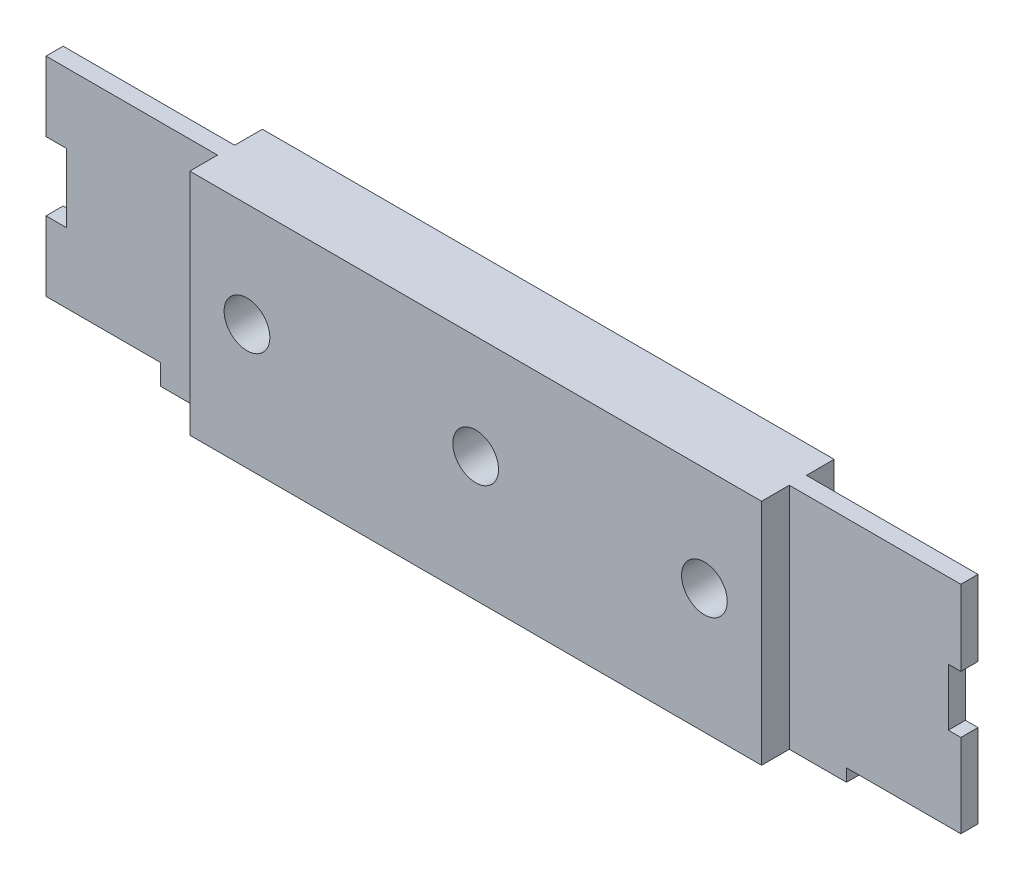
ISO-10303-21;
HEADER;
FILE_DESCRIPTION(('STEP AP214'),'2;1');
FILE_NAME('part.step','',(''),(''),'','','');
FILE_SCHEMA(('AUTOMOTIVE_DESIGN { 1 0 10303 214 1 1 1 1 }'));
ENDSEC;
DATA;
#1=APPLICATION_CONTEXT('core data for automotive mechanical design processes');
#2=APPLICATION_PROTOCOL_DEFINITION('international standard','automotive_design',2000,#1);
#3=PRODUCT_CONTEXT('',#1,'mechanical');
#4=PRODUCT('Part','Part','',(#3));
#5=PRODUCT_RELATED_PRODUCT_CATEGORY('part','',(#4));
#6=PRODUCT_DEFINITION_FORMATION('','',#4);
#7=PRODUCT_DEFINITION_CONTEXT('part definition',#1,'design');
#8=PRODUCT_DEFINITION('design','',#6,#7);
#9=PRODUCT_DEFINITION_SHAPE('','',#8);
#10=(LENGTH_UNIT() NAMED_UNIT(*) SI_UNIT(.MILLI.,.METRE.));
#11=(NAMED_UNIT(*) PLANE_ANGLE_UNIT() SI_UNIT($,.RADIAN.));
#12=(NAMED_UNIT(*) SI_UNIT($,.STERADIAN.) SOLID_ANGLE_UNIT());
#13=UNCERTAINTY_MEASURE_WITH_UNIT(LENGTH_MEASURE(1.E-05),#10,'distance_accuracy_value','');
#14=(GEOMETRIC_REPRESENTATION_CONTEXT(3) GLOBAL_UNCERTAINTY_ASSIGNED_CONTEXT((#13)) GLOBAL_UNIT_ASSIGNED_CONTEXT((#10,
#11,#12)) REPRESENTATION_CONTEXT('',''));
#15=CARTESIAN_POINT('',(0.,0.,0.));
#16=DIRECTION('',(0.,0.,1.));
#17=DIRECTION('',(1.,0.,0.));
#18=AXIS2_PLACEMENT_3D('',#15,#16,#17);
#19=CARTESIAN_POINT('',(0.,0.,0.75));
#20=DIRECTION('',(0.,0.,-1.));
#21=DIRECTION('',(-1.,0.,0.));
#22=AXIS2_PLACEMENT_3D('',#19,#20,#21);
#23=PLANE('',#22);
#24=DIRECTION('',(0.,-1.,0.));
#25=VECTOR('',#24,1.);
#26=CARTESIAN_POINT('',(-25.0000000000001,0.,0.75));
#27=LINE('',#26,#25);
#28=CARTESIAN_POINT('',(-25.0000000000001,9.09999999999999,0.75));
#29=VERTEX_POINT('',#28);
#30=CARTESIAN_POINT('',(-25.0000000000001,-10.9,0.75));
#31=VERTEX_POINT('',#30);
#32=EDGE_CURVE('E218',#29,#31,#27,.T.);
#33=ORIENTED_EDGE('',*,*,#32,.F.);
#34=DIRECTION('',(-1.,0.,0.));
#35=VECTOR('',#34,1.);
#36=CARTESIAN_POINT('',(-40.0000000000001,9.09999999999999,0.75));
#37=LINE('',#36,#35);
#38=CARTESIAN_POINT('',(-40.0000000000001,9.09999999999999,0.75));
#39=VERTEX_POINT('',#38);
#40=EDGE_CURVE('E265',#29,#39,#37,.T.);
#41=ORIENTED_EDGE('',*,*,#40,.T.);
#42=DIRECTION('',(0.,-1.,0.));
#43=VECTOR('',#42,1.);
#44=CARTESIAN_POINT('',(-40.,2.99999999999999,0.75));
#45=LINE('',#44,#43);
#46=CARTESIAN_POINT('',(-40.,2.99999999999999,0.75));
#47=VERTEX_POINT('',#46);
#48=EDGE_CURVE('E233',#39,#47,#45,.T.);
#49=ORIENTED_EDGE('',*,*,#48,.T.);
#50=DIRECTION('',(1.,0.,0.));
#51=VECTOR('',#50,1.);
#52=CARTESIAN_POINT('',(-38.2,2.99999999999999,0.75));
#53=LINE('',#52,#51);
#54=CARTESIAN_POINT('',(-38.2,2.99999999999999,0.75));
#55=VERTEX_POINT('',#54);
#56=EDGE_CURVE('E236',#47,#55,#53,.T.);
#57=ORIENTED_EDGE('',*,*,#56,.T.);
#58=DIRECTION('',(0.,-1.,0.));
#59=VECTOR('',#58,1.);
#60=CARTESIAN_POINT('',(-38.2,-3.00000000000001,0.75));
#61=LINE('',#60,#59);
#62=CARTESIAN_POINT('',(-38.2,-3.00000000000001,0.75));
#63=VERTEX_POINT('',#62);
#64=EDGE_CURVE('E239',#55,#63,#61,.T.);
#65=ORIENTED_EDGE('',*,*,#64,.T.);
#66=DIRECTION('',(-1.,0.,0.));
#67=VECTOR('',#66,1.);
#68=CARTESIAN_POINT('',(-40.,-3.,0.75));
#69=LINE('',#68,#67);
#70=CARTESIAN_POINT('',(-40.,-3.,0.75));
#71=VERTEX_POINT('',#70);
#72=EDGE_CURVE('E241',#63,#71,#69,.T.);
#73=ORIENTED_EDGE('',*,*,#72,.T.);
#74=DIRECTION('',(0.,-1.,0.));
#75=VECTOR('',#74,1.);
#76=CARTESIAN_POINT('',(-40.,-9.1,0.75));
#77=LINE('',#76,#75);
#78=CARTESIAN_POINT('',(-40.,-9.1,0.75));
#79=VERTEX_POINT('',#78);
#80=EDGE_CURVE('E243',#71,#79,#77,.T.);
#81=ORIENTED_EDGE('',*,*,#80,.T.);
#82=DIRECTION('',(1.,0.,0.));
#83=VECTOR('',#82,1.);
#84=CARTESIAN_POINT('',(-30.,-9.1,0.75));
#85=LINE('',#84,#83);
#86=CARTESIAN_POINT('',(-30.,-9.1,0.75));
#87=VERTEX_POINT('',#86);
#88=EDGE_CURVE('E245',#79,#87,#85,.T.);
#89=ORIENTED_EDGE('',*,*,#88,.T.);
#90=DIRECTION('',(0.,-1.,0.));
#91=VECTOR('',#90,1.);
#92=CARTESIAN_POINT('',(-30.,-10.9,0.75));
#93=LINE('',#92,#91);
#94=CARTESIAN_POINT('',(-30.,-10.9,0.75));
#95=VERTEX_POINT('',#94);
#96=EDGE_CURVE('E247',#87,#95,#93,.T.);
#97=ORIENTED_EDGE('',*,*,#96,.T.);
#98=DIRECTION('',(1.,0.,0.));
#99=VECTOR('',#98,1.);
#100=CARTESIAN_POINT('',(30.,-10.9,0.75));
#101=LINE('',#100,#99);
#102=EDGE_CURVE('E56',#95,#31,#101,.T.);
#103=ORIENTED_EDGE('',*,*,#102,.T.);
#104=EDGE_LOOP('',(#33,#41,#49,#57,#65,#73,#81,#89,#97,#103));
#105=FACE_BOUND('',#104,.T.);
#106=ADVANCED_FACE('F33',(#105),#23,.F.);
#107=DIRECTION('',(0.,1.,0.));
#108=VECTOR('',#107,1.);
#109=CARTESIAN_POINT('',(25.,0.,0.75));
#110=LINE('',#109,#108);
#111=CARTESIAN_POINT('',(25.,-10.9,0.75));
#112=VERTEX_POINT('',#111);
#113=CARTESIAN_POINT('',(25.,9.09999999999999,0.75));
#114=VERTEX_POINT('',#113);
#115=EDGE_CURVE('E48',#112,#114,#110,.T.);
#116=ORIENTED_EDGE('',*,*,#115,.F.);
#117=CARTESIAN_POINT('',(30.,-10.9,0.75));
#118=VERTEX_POINT('',#117);
#119=EDGE_CURVE('E249',#112,#118,#101,.T.);
#120=ORIENTED_EDGE('',*,*,#119,.T.);
#121=DIRECTION('',(0.,1.,0.));
#122=VECTOR('',#121,1.);
#123=CARTESIAN_POINT('',(30.,-9.79999999999999,0.75));
#124=LINE('',#123,#122);
#125=CARTESIAN_POINT('',(30.,-9.79999999999999,0.75));
#126=VERTEX_POINT('',#125);
#127=EDGE_CURVE('E251',#118,#126,#124,.T.);
#128=ORIENTED_EDGE('',*,*,#127,.T.);
#129=DIRECTION('',(1.,0.,0.));
#130=VECTOR('',#129,1.);
#131=CARTESIAN_POINT('',(40.,-9.79999999999999,0.75));
#132=LINE('',#131,#130);
#133=CARTESIAN_POINT('',(40.,-9.79999999999999,0.75));
#134=VERTEX_POINT('',#133);
#135=EDGE_CURVE('E253',#126,#134,#132,.T.);
#136=ORIENTED_EDGE('',*,*,#135,.T.);
#137=DIRECTION('',(0.,1.,0.));
#138=VECTOR('',#137,1.);
#139=CARTESIAN_POINT('',(40.,-2.5,0.75));
#140=LINE('',#139,#138);
#141=CARTESIAN_POINT('',(40.,-2.5,0.75));
#142=VERTEX_POINT('',#141);
#143=EDGE_CURVE('E255',#134,#142,#140,.T.);
#144=ORIENTED_EDGE('',*,*,#143,.T.);
#145=DIRECTION('',(-1.,0.,0.));
#146=VECTOR('',#145,1.);
#147=CARTESIAN_POINT('',(38.9,-2.5,0.75));
#148=LINE('',#147,#146);
#149=CARTESIAN_POINT('',(38.9,-2.5,0.75));
#150=VERTEX_POINT('',#149);
#151=EDGE_CURVE('E257',#142,#150,#148,.T.);
#152=ORIENTED_EDGE('',*,*,#151,.T.);
#153=DIRECTION('',(0.,1.,0.));
#154=VECTOR('',#153,1.);
#155=CARTESIAN_POINT('',(38.9,2.5,0.75));
#156=LINE('',#155,#154);
#157=CARTESIAN_POINT('',(38.9,2.5,0.75));
#158=VERTEX_POINT('',#157);
#159=EDGE_CURVE('E259',#150,#158,#156,.T.);
#160=ORIENTED_EDGE('',*,*,#159,.T.);
#161=DIRECTION('',(1.,0.,0.));
#162=VECTOR('',#161,1.);
#163=CARTESIAN_POINT('',(40.,2.5,0.75));
#164=LINE('',#163,#162);
#165=CARTESIAN_POINT('',(40.,2.5,0.75));
#166=VERTEX_POINT('',#165);
#167=EDGE_CURVE('E261',#158,#166,#164,.T.);
#168=ORIENTED_EDGE('',*,*,#167,.T.);
#169=DIRECTION('',(0.,1.,0.));
#170=VECTOR('',#169,1.);
#171=CARTESIAN_POINT('',(40.0000000000001,9.09999999999999,0.75));
#172=LINE('',#171,#170);
#173=CARTESIAN_POINT('',(40.0000000000001,9.09999999999999,0.75));
#174=VERTEX_POINT('',#173);
#175=EDGE_CURVE('E263',#166,#174,#172,.T.);
#176=ORIENTED_EDGE('',*,*,#175,.T.);
#177=EDGE_CURVE('E266',#174,#114,#37,.T.);
#178=ORIENTED_EDGE('',*,*,#177,.T.);
#179=EDGE_LOOP('',(#116,#120,#128,#136,#144,#152,#160,#168,#176,#178));
#180=FACE_BOUND('',#179,.T.);
#181=ADVANCED_FACE('F429',(#180),#23,.F.);
#182=CARTESIAN_POINT('',(0.,0.,-0.75));
#183=DIRECTION('',(0.,0.,-1.));
#184=DIRECTION('',(-1.,0.,0.));
#185=AXIS2_PLACEMENT_3D('',#182,#183,#184);
#186=PLANE('',#185);
#187=DIRECTION('',(-1.,0.,0.));
#188=VECTOR('',#187,1.);
#189=CARTESIAN_POINT('',(-40.0000000000001,9.09999999999999,-0.75));
#190=LINE('',#189,#188);
#191=CARTESIAN_POINT('',(-25.0000000000001,9.09999999999999,-0.75));
#192=VERTEX_POINT('',#191);
#193=CARTESIAN_POINT('',(-40.0000000000001,9.09999999999999,-0.75));
#194=VERTEX_POINT('',#193);
#195=EDGE_CURVE('E301',#192,#194,#190,.T.);
#196=ORIENTED_EDGE('',*,*,#195,.F.);
#197=DIRECTION('',(0.,-1.,0.));
#198=VECTOR('',#197,1.);
#199=CARTESIAN_POINT('',(-25.0000000000001,0.,-0.75));
#200=LINE('',#199,#198);
#201=CARTESIAN_POINT('',(-25.0000000000001,-10.9,-0.75));
#202=VERTEX_POINT('',#201);
#203=EDGE_CURVE('E228',#192,#202,#200,.T.);
#204=ORIENTED_EDGE('',*,*,#203,.T.);
#205=DIRECTION('',(1.,0.,0.));
#206=VECTOR('',#205,1.);
#207=CARTESIAN_POINT('',(30.,-10.9,-0.75));
#208=LINE('',#207,#206);
#209=CARTESIAN_POINT('',(-30.,-10.9,-0.75));
#210=VERTEX_POINT('',#209);
#211=EDGE_CURVE('E284',#210,#202,#208,.T.);
#212=ORIENTED_EDGE('',*,*,#211,.F.);
#213=DIRECTION('',(0.,-1.,0.));
#214=VECTOR('',#213,1.);
#215=CARTESIAN_POINT('',(-30.,-10.9,-0.75));
#216=LINE('',#215,#214);
#217=CARTESIAN_POINT('',(-30.,-9.1,-0.75));
#218=VERTEX_POINT('',#217);
#219=EDGE_CURVE('E281',#218,#210,#216,.T.);
#220=ORIENTED_EDGE('',*,*,#219,.F.);
#221=DIRECTION('',(1.,0.,0.));
#222=VECTOR('',#221,1.);
#223=CARTESIAN_POINT('',(-30.,-9.1,-0.75));
#224=LINE('',#223,#222);
#225=CARTESIAN_POINT('',(-40.,-9.1,-0.75));
#226=VERTEX_POINT('',#225);
#227=EDGE_CURVE('E279',#226,#218,#224,.T.);
#228=ORIENTED_EDGE('',*,*,#227,.F.);
#229=DIRECTION('',(0.,-1.,0.));
#230=VECTOR('',#229,1.);
#231=CARTESIAN_POINT('',(-40.,-9.1,-0.75));
#232=LINE('',#231,#230);
#233=CARTESIAN_POINT('',(-40.,-3.,-0.75));
#234=VERTEX_POINT('',#233);
#235=EDGE_CURVE('E277',#234,#226,#232,.T.);
#236=ORIENTED_EDGE('',*,*,#235,.F.);
#237=DIRECTION('',(-1.,0.,0.));
#238=VECTOR('',#237,1.);
#239=CARTESIAN_POINT('',(-40.,-3.,-0.75));
#240=LINE('',#239,#238);
#241=CARTESIAN_POINT('',(-38.2,-3.00000000000001,-0.75));
#242=VERTEX_POINT('',#241);
#243=EDGE_CURVE('E275',#242,#234,#240,.T.);
#244=ORIENTED_EDGE('',*,*,#243,.F.);
#245=DIRECTION('',(0.,-1.,0.));
#246=VECTOR('',#245,1.);
#247=CARTESIAN_POINT('',(-38.2,-3.00000000000001,-0.75));
#248=LINE('',#247,#246);
#249=CARTESIAN_POINT('',(-38.2,2.99999999999999,-0.75));
#250=VERTEX_POINT('',#249);
#251=EDGE_CURVE('E273',#250,#242,#248,.T.);
#252=ORIENTED_EDGE('',*,*,#251,.F.);
#253=DIRECTION('',(1.,0.,0.));
#254=VECTOR('',#253,1.);
#255=CARTESIAN_POINT('',(-38.2,2.99999999999999,-0.75));
#256=LINE('',#255,#254);
#257=CARTESIAN_POINT('',(-40.,2.99999999999999,-0.75));
#258=VERTEX_POINT('',#257);
#259=EDGE_CURVE('E271',#258,#250,#256,.T.);
#260=ORIENTED_EDGE('',*,*,#259,.F.);
#261=DIRECTION('',(0.,-1.,0.));
#262=VECTOR('',#261,1.);
#263=CARTESIAN_POINT('',(-40.,2.99999999999999,-0.75));
#264=LINE('',#263,#262);
#265=EDGE_CURVE('E232',#194,#258,#264,.T.);
#266=ORIENTED_EDGE('',*,*,#265,.F.);
#267=EDGE_LOOP('',(#196,#204,#212,#220,#228,#236,#244,#252,#260,#266));
#268=FACE_BOUND('',#267,.T.);
#269=ADVANCED_FACE('F355',(#268),#186,.T.);
#270=CARTESIAN_POINT('',(25.,-10.9,-0.75));
#271=VERTEX_POINT('',#270);
#272=CARTESIAN_POINT('',(30.,-10.9,-0.75));
#273=VERTEX_POINT('',#272);
#274=EDGE_CURVE('E283',#271,#273,#208,.T.);
#275=ORIENTED_EDGE('',*,*,#274,.F.);
#276=DIRECTION('',(0.,1.,0.));
#277=VECTOR('',#276,1.);
#278=CARTESIAN_POINT('',(25.,0.,-0.75));
#279=LINE('',#278,#277);
#280=CARTESIAN_POINT('',(25.,9.09999999999999,-0.75));
#281=VERTEX_POINT('',#280);
#282=EDGE_CURVE('E219',#271,#281,#279,.T.);
#283=ORIENTED_EDGE('',*,*,#282,.T.);
#284=CARTESIAN_POINT('',(40.0000000000001,9.09999999999999,-0.75));
#285=VERTEX_POINT('',#284);
#286=EDGE_CURVE('E237',#285,#281,#190,.T.);
#287=ORIENTED_EDGE('',*,*,#286,.F.);
#288=DIRECTION('',(0.,1.,0.));
#289=VECTOR('',#288,1.);
#290=CARTESIAN_POINT('',(40.0000000000001,9.09999999999999,-0.75));
#291=LINE('',#290,#289);
#292=CARTESIAN_POINT('',(40.,2.5,-0.75));
#293=VERTEX_POINT('',#292);
#294=EDGE_CURVE('E299',#293,#285,#291,.T.);
#295=ORIENTED_EDGE('',*,*,#294,.F.);
#296=DIRECTION('',(1.,0.,0.));
#297=VECTOR('',#296,1.);
#298=CARTESIAN_POINT('',(40.,2.5,-0.75));
#299=LINE('',#298,#297);
#300=CARTESIAN_POINT('',(38.9,2.5,-0.75));
#301=VERTEX_POINT('',#300);
#302=EDGE_CURVE('E297',#301,#293,#299,.T.);
#303=ORIENTED_EDGE('',*,*,#302,.F.);
#304=DIRECTION('',(0.,1.,0.));
#305=VECTOR('',#304,1.);
#306=CARTESIAN_POINT('',(38.9,2.5,-0.75));
#307=LINE('',#306,#305);
#308=CARTESIAN_POINT('',(38.9,-2.5,-0.75));
#309=VERTEX_POINT('',#308);
#310=EDGE_CURVE('E295',#309,#301,#307,.T.);
#311=ORIENTED_EDGE('',*,*,#310,.F.);
#312=DIRECTION('',(-1.,0.,0.));
#313=VECTOR('',#312,1.);
#314=CARTESIAN_POINT('',(38.9,-2.5,-0.75));
#315=LINE('',#314,#313);
#316=CARTESIAN_POINT('',(40.,-2.5,-0.75));
#317=VERTEX_POINT('',#316);
#318=EDGE_CURVE('E293',#317,#309,#315,.T.);
#319=ORIENTED_EDGE('',*,*,#318,.F.);
#320=DIRECTION('',(0.,1.,0.));
#321=VECTOR('',#320,1.);
#322=CARTESIAN_POINT('',(40.,-2.5,-0.75));
#323=LINE('',#322,#321);
#324=CARTESIAN_POINT('',(40.,-9.79999999999999,-0.75));
#325=VERTEX_POINT('',#324);
#326=EDGE_CURVE('E291',#325,#317,#323,.T.);
#327=ORIENTED_EDGE('',*,*,#326,.F.);
#328=DIRECTION('',(1.,0.,0.));
#329=VECTOR('',#328,1.);
#330=CARTESIAN_POINT('',(40.,-9.79999999999999,-0.75));
#331=LINE('',#330,#329);
#332=CARTESIAN_POINT('',(30.,-9.79999999999999,-0.75));
#333=VERTEX_POINT('',#332);
#334=EDGE_CURVE('E289',#333,#325,#331,.T.);
#335=ORIENTED_EDGE('',*,*,#334,.F.);
#336=DIRECTION('',(0.,1.,0.));
#337=VECTOR('',#336,1.);
#338=CARTESIAN_POINT('',(30.,-9.79999999999999,-0.75));
#339=LINE('',#338,#337);
#340=EDGE_CURVE('E287',#273,#333,#339,.T.);
#341=ORIENTED_EDGE('',*,*,#340,.F.);
#342=EDGE_LOOP('',(#275,#283,#287,#295,#303,#311,#319,#327,#335,#341));
#343=FACE_BOUND('',#342,.T.);
#344=ADVANCED_FACE('F417',(#343),#186,.T.);
#345=CARTESIAN_POINT('',(-40.,2.99999999999999,0.75));
#346=DIRECTION('',(1.,0.,0.));
#347=DIRECTION('',(0.,1.,0.));
#348=AXIS2_PLACEMENT_3D('',#345,#346,#347);
#349=PLANE('',#348);
#350=ORIENTED_EDGE('',*,*,#265,.T.);
#351=DIRECTION('',(0.,0.,-1.));
#352=VECTOR('',#351,1.);
#353=CARTESIAN_POINT('',(-40.,2.99999999999999,0.75));
#354=LINE('',#353,#352);
#355=EDGE_CURVE('E11',#47,#258,#354,.T.);
#356=ORIENTED_EDGE('',*,*,#355,.F.);
#357=ORIENTED_EDGE('',*,*,#48,.F.);
#358=DIRECTION('',(0.,0.,-1.));
#359=VECTOR('',#358,1.);
#360=CARTESIAN_POINT('',(-40.0000000000001,9.09999999999999,0.75));
#361=LINE('',#360,#359);
#362=EDGE_CURVE('E268',#39,#194,#361,.T.);
#363=ORIENTED_EDGE('',*,*,#362,.T.);
#364=EDGE_LOOP('',(#350,#356,#357,#363));
#365=FACE_BOUND('',#364,.T.);
#366=ADVANCED_FACE('F35',(#365),#349,.F.);
#367=CARTESIAN_POINT('',(-38.2,2.99999999999999,0.75));
#368=DIRECTION('',(0.,1.,0.));
#369=DIRECTION('',(-1.,0.,0.));
#370=AXIS2_PLACEMENT_3D('',#367,#368,#369);
#371=PLANE('',#370);
#372=ORIENTED_EDGE('',*,*,#259,.T.);
#373=DIRECTION('',(0.,0.,-1.));
#374=VECTOR('',#373,1.);
#375=CARTESIAN_POINT('',(-38.2,2.99999999999999,0.75));
#376=LINE('',#375,#374);
#377=EDGE_CURVE('E41',#55,#250,#376,.T.);
#378=ORIENTED_EDGE('',*,*,#377,.F.);
#379=ORIENTED_EDGE('',*,*,#56,.F.);
#380=ORIENTED_EDGE('',*,*,#355,.T.);
#381=EDGE_LOOP('',(#372,#378,#379,#380));
#382=FACE_BOUND('',#381,.T.);
#383=ADVANCED_FACE('F371',(#382),#371,.F.);
#384=CARTESIAN_POINT('',(-38.2,-3.00000000000001,0.75));
#385=DIRECTION('',(1.,0.,0.));
#386=DIRECTION('',(0.,0.,-1.));
#387=AXIS2_PLACEMENT_3D('',#384,#385,#386);
#388=PLANE('',#387);
#389=ORIENTED_EDGE('',*,*,#251,.T.);
#390=DIRECTION('',(0.,0.,-1.));
#391=VECTOR('',#390,1.);
#392=CARTESIAN_POINT('',(-38.2,-3.00000000000001,0.75));
#393=LINE('',#392,#391);
#394=EDGE_CURVE('E342',#63,#242,#393,.T.);
#395=ORIENTED_EDGE('',*,*,#394,.F.);
#396=ORIENTED_EDGE('',*,*,#64,.F.);
#397=ORIENTED_EDGE('',*,*,#377,.T.);
#398=EDGE_LOOP('',(#389,#395,#396,#397));
#399=FACE_BOUND('',#398,.T.);
#400=ADVANCED_FACE('F349',(#399),#388,.F.);
#401=CARTESIAN_POINT('',(-40.,-3.,0.75));
#402=DIRECTION('',(0.,-1.,0.));
#403=DIRECTION('',(1.,0.,0.));
#404=AXIS2_PLACEMENT_3D('',#401,#402,#403);
#405=PLANE('',#404);
#406=ORIENTED_EDGE('',*,*,#243,.T.);
#407=DIRECTION('',(0.,0.,-1.));
#408=VECTOR('',#407,1.);
#409=CARTESIAN_POINT('',(-40.,-3.,0.75));
#410=LINE('',#409,#408);
#411=EDGE_CURVE('E339',#71,#234,#410,.T.);
#412=ORIENTED_EDGE('',*,*,#411,.F.);
#413=ORIENTED_EDGE('',*,*,#72,.F.);
#414=ORIENTED_EDGE('',*,*,#394,.T.);
#415=EDGE_LOOP('',(#406,#412,#413,#414));
#416=FACE_BOUND('',#415,.T.);
#417=ADVANCED_FACE('F361',(#416),#405,.F.);
#418=CARTESIAN_POINT('',(-40.,-9.1,0.75));
#419=DIRECTION('',(1.,0.,0.));
#420=DIRECTION('',(0.,1.,0.));
#421=AXIS2_PLACEMENT_3D('',#418,#419,#420);
#422=PLANE('',#421);
#423=ORIENTED_EDGE('',*,*,#235,.T.);
#424=DIRECTION('',(0.,0.,-1.));
#425=VECTOR('',#424,1.);
#426=CARTESIAN_POINT('',(-40.,-9.1,0.75));
#427=LINE('',#426,#425);
#428=EDGE_CURVE('E336',#79,#226,#427,.T.);
#429=ORIENTED_EDGE('',*,*,#428,.F.);
#430=ORIENTED_EDGE('',*,*,#80,.F.);
#431=ORIENTED_EDGE('',*,*,#411,.T.);
#432=EDGE_LOOP('',(#423,#429,#430,#431));
#433=FACE_BOUND('',#432,.T.);
#434=ADVANCED_FACE('F365',(#433),#422,.F.);
#435=CARTESIAN_POINT('',(-30.,-9.1,0.75));
#436=DIRECTION('',(0.,1.,0.));
#437=DIRECTION('',(-1.,0.,0.));
#438=AXIS2_PLACEMENT_3D('',#435,#436,#437);
#439=PLANE('',#438);
#440=ORIENTED_EDGE('',*,*,#227,.T.);
#441=DIRECTION('',(0.,0.,-1.));
#442=VECTOR('',#441,1.);
#443=CARTESIAN_POINT('',(-30.,-9.1,0.75));
#444=LINE('',#443,#442);
#445=EDGE_CURVE('E333',#87,#218,#444,.T.);
#446=ORIENTED_EDGE('',*,*,#445,.F.);
#447=ORIENTED_EDGE('',*,*,#88,.F.);
#448=ORIENTED_EDGE('',*,*,#428,.T.);
#449=EDGE_LOOP('',(#440,#446,#447,#448));
#450=FACE_BOUND('',#449,.T.);
#451=ADVANCED_FACE('F505',(#450),#439,.F.);
#452=CARTESIAN_POINT('',(-30.,-10.9,0.75));
#453=DIRECTION('',(1.,0.,0.));
#454=DIRECTION('',(0.,1.,0.));
#455=AXIS2_PLACEMENT_3D('',#452,#453,#454);
#456=PLANE('',#455);
#457=ORIENTED_EDGE('',*,*,#219,.T.);
#458=DIRECTION('',(0.,0.,-1.));
#459=VECTOR('',#458,1.);
#460=CARTESIAN_POINT('',(-30.,-10.9,0.75));
#461=LINE('',#460,#459);
#462=EDGE_CURVE('E330',#95,#210,#461,.T.);
#463=ORIENTED_EDGE('',*,*,#462,.F.);
#464=ORIENTED_EDGE('',*,*,#96,.F.);
#465=ORIENTED_EDGE('',*,*,#445,.T.);
#466=EDGE_LOOP('',(#457,#463,#464,#465));
#467=FACE_BOUND('',#466,.T.);
#468=ADVANCED_FACE('F502',(#467),#456,.F.);
#469=CARTESIAN_POINT('',(30.,-10.9,0.75));
#470=DIRECTION('',(0.,1.,0.));
#471=DIRECTION('',(-1.,0.,0.));
#472=AXIS2_PLACEMENT_3D('',#469,#470,#471);
#473=PLANE('',#472);
#474=ORIENTED_EDGE('',*,*,#119,.F.);
#475=DIRECTION('',(0.,0.,-1.));
#476=VECTOR('',#475,1.);
#477=CARTESIAN_POINT('',(25.,-10.9,3.175));
#478=LINE('',#477,#476);
#479=CARTESIAN_POINT('',(25.,-10.9,3.175));
#480=VERTEX_POINT('',#479);
#481=EDGE_CURVE('E201',#480,#112,#478,.T.);
#482=ORIENTED_EDGE('',*,*,#481,.F.);
#483=DIRECTION('',(1.,0.,0.));
#484=VECTOR('',#483,1.);
#485=CARTESIAN_POINT('',(-25.0000000000001,-10.9,3.175));
#486=LINE('',#485,#484);
#487=CARTESIAN_POINT('',(-25.0000000000001,-10.9,3.175));
#488=VERTEX_POINT('',#487);
#489=EDGE_CURVE('E195',#488,#480,#486,.T.);
#490=ORIENTED_EDGE('',*,*,#489,.F.);
#491=DIRECTION('',(0.,0.,-1.));
#492=VECTOR('',#491,1.);
#493=CARTESIAN_POINT('',(-25.0000000000001,-10.9,3.175));
#494=LINE('',#493,#492);
#495=EDGE_CURVE('E199',#488,#31,#494,.T.);
#496=ORIENTED_EDGE('',*,*,#495,.T.);
#497=ORIENTED_EDGE('',*,*,#102,.F.);
#498=ORIENTED_EDGE('',*,*,#462,.T.);
#499=ORIENTED_EDGE('',*,*,#211,.T.);
#500=CARTESIAN_POINT('',(-25.0000000000001,-10.9,-3.175));
#501=VERTEX_POINT('',#500);
#502=EDGE_CURVE('E220',#202,#501,#494,.T.);
#503=ORIENTED_EDGE('',*,*,#502,.T.);
#504=DIRECTION('',(1.,0.,0.));
#505=VECTOR('',#504,1.);
#506=CARTESIAN_POINT('',(-25.0000000000001,-10.9,-3.175));
#507=LINE('',#506,#505);
#508=CARTESIAN_POINT('',(25.,-10.9,-3.175));
#509=VERTEX_POINT('',#508);
#510=EDGE_CURVE('E391',#501,#509,#507,.T.);
#511=ORIENTED_EDGE('',*,*,#510,.T.);
#512=EDGE_CURVE('E407',#271,#509,#478,.T.);
#513=ORIENTED_EDGE('',*,*,#512,.F.);
#514=ORIENTED_EDGE('',*,*,#274,.T.);
#515=DIRECTION('',(0.,0.,-1.));
#516=VECTOR('',#515,1.);
#517=CARTESIAN_POINT('',(30.,-10.9,0.75));
#518=LINE('',#517,#516);
#519=EDGE_CURVE('E327',#118,#273,#518,.T.);
#520=ORIENTED_EDGE('',*,*,#519,.F.);
#521=EDGE_LOOP('',(#474,#482,#490,#496,#497,#498,#499,#503,#511,#513,#514,#520));
#522=FACE_BOUND('',#521,.T.);
#523=ADVANCED_FACE('F197',(#522),#473,.F.);
#524=CARTESIAN_POINT('',(30.,-9.79999999999999,0.75));
#525=DIRECTION('',(-1.,0.,0.));
#526=DIRECTION('',(0.,0.,1.));
#527=AXIS2_PLACEMENT_3D('',#524,#525,#526);
#528=PLANE('',#527);
#529=ORIENTED_EDGE('',*,*,#340,.T.);
#530=DIRECTION('',(0.,0.,-1.));
#531=VECTOR('',#530,1.);
#532=CARTESIAN_POINT('',(30.,-9.79999999999999,0.75));
#533=LINE('',#532,#531);
#534=EDGE_CURVE('E324',#126,#333,#533,.T.);
#535=ORIENTED_EDGE('',*,*,#534,.F.);
#536=ORIENTED_EDGE('',*,*,#127,.F.);
#537=ORIENTED_EDGE('',*,*,#519,.T.);
#538=EDGE_LOOP('',(#529,#535,#536,#537));
#539=FACE_BOUND('',#538,.T.);
#540=ADVANCED_FACE('F422',(#539),#528,.F.);
#541=CARTESIAN_POINT('',(40.,-9.79999999999999,0.75));
#542=DIRECTION('',(0.,1.,0.));
#543=DIRECTION('',(-1.,0.,0.));
#544=AXIS2_PLACEMENT_3D('',#541,#542,#543);
#545=PLANE('',#544);
#546=ORIENTED_EDGE('',*,*,#334,.T.);
#547=DIRECTION('',(0.,0.,-1.));
#548=VECTOR('',#547,1.);
#549=CARTESIAN_POINT('',(40.,-9.79999999999999,0.75));
#550=LINE('',#549,#548);
#551=EDGE_CURVE('E321',#134,#325,#550,.T.);
#552=ORIENTED_EDGE('',*,*,#551,.F.);
#553=ORIENTED_EDGE('',*,*,#135,.F.);
#554=ORIENTED_EDGE('',*,*,#534,.T.);
#555=EDGE_LOOP('',(#546,#552,#553,#554));
#556=FACE_BOUND('',#555,.T.);
#557=ADVANCED_FACE('F426',(#556),#545,.F.);
#558=CARTESIAN_POINT('',(40.,-2.5,0.75));
#559=DIRECTION('',(-1.,0.,0.));
#560=DIRECTION('',(0.,-1.,0.));
#561=AXIS2_PLACEMENT_3D('',#558,#559,#560);
#562=PLANE('',#561);
#563=ORIENTED_EDGE('',*,*,#326,.T.);
#564=DIRECTION('',(0.,0.,-1.));
#565=VECTOR('',#564,1.);
#566=CARTESIAN_POINT('',(40.,-2.5,0.75));
#567=LINE('',#566,#565);
#568=EDGE_CURVE('E318',#142,#317,#567,.T.);
#569=ORIENTED_EDGE('',*,*,#568,.F.);
#570=ORIENTED_EDGE('',*,*,#143,.F.);
#571=ORIENTED_EDGE('',*,*,#551,.T.);
#572=EDGE_LOOP('',(#563,#569,#570,#571));
#573=FACE_BOUND('',#572,.T.);
#574=ADVANCED_FACE('F491',(#573),#562,.F.);
#575=CARTESIAN_POINT('',(38.9,-2.5,0.75));
#576=DIRECTION('',(0.,-1.,0.));
#577=DIRECTION('',(0.,0.,-1.));
#578=AXIS2_PLACEMENT_3D('',#575,#576,#577);
#579=PLANE('',#578);
#580=ORIENTED_EDGE('',*,*,#318,.T.);
#581=DIRECTION('',(0.,0.,-1.));
#582=VECTOR('',#581,1.);
#583=CARTESIAN_POINT('',(38.9,-2.5,0.75));
#584=LINE('',#583,#582);
#585=EDGE_CURVE('E315',#150,#309,#584,.T.);
#586=ORIENTED_EDGE('',*,*,#585,.F.);
#587=ORIENTED_EDGE('',*,*,#151,.F.);
#588=ORIENTED_EDGE('',*,*,#568,.T.);
#589=EDGE_LOOP('',(#580,#586,#587,#588));
#590=FACE_BOUND('',#589,.T.);
#591=ADVANCED_FACE('F487',(#590),#579,.F.);
#592=CARTESIAN_POINT('',(38.9,2.5,0.75));
#593=DIRECTION('',(-1.,0.,0.));
#594=DIRECTION('',(0.,0.,1.));
#595=AXIS2_PLACEMENT_3D('',#592,#593,#594);
#596=PLANE('',#595);
#597=ORIENTED_EDGE('',*,*,#310,.T.);
#598=DIRECTION('',(0.,0.,-1.));
#599=VECTOR('',#598,1.);
#600=CARTESIAN_POINT('',(38.9,2.5,0.75));
#601=LINE('',#600,#599);
#602=EDGE_CURVE('E312',#158,#301,#601,.T.);
#603=ORIENTED_EDGE('',*,*,#602,.F.);
#604=ORIENTED_EDGE('',*,*,#159,.F.);
#605=ORIENTED_EDGE('',*,*,#585,.T.);
#606=EDGE_LOOP('',(#597,#603,#604,#605));
#607=FACE_BOUND('',#606,.T.);
#608=ADVANCED_FACE('F483',(#607),#596,.F.);
#609=CARTESIAN_POINT('',(40.,2.5,0.75));
#610=DIRECTION('',(0.,1.,0.));
#611=DIRECTION('',(0.,0.,1.));
#612=AXIS2_PLACEMENT_3D('',#609,#610,#611);
#613=PLANE('',#612);
#614=ORIENTED_EDGE('',*,*,#302,.T.);
#615=DIRECTION('',(0.,0.,-1.));
#616=VECTOR('',#615,1.);
#617=CARTESIAN_POINT('',(40.,2.5,0.75));
#618=LINE('',#617,#616);
#619=EDGE_CURVE('E309',#166,#293,#618,.T.);
#620=ORIENTED_EDGE('',*,*,#619,.F.);
#621=ORIENTED_EDGE('',*,*,#167,.F.);
#622=ORIENTED_EDGE('',*,*,#602,.T.);
#623=EDGE_LOOP('',(#614,#620,#621,#622));
#624=FACE_BOUND('',#623,.T.);
#625=ADVANCED_FACE('F479',(#624),#613,.F.);
#626=CARTESIAN_POINT('',(40.0000000000001,9.09999999999999,0.75));
#627=DIRECTION('',(-1.,0.,0.));
#628=DIRECTION('',(0.,-1.,0.));
#629=AXIS2_PLACEMENT_3D('',#626,#627,#628);
#630=PLANE('',#629);
#631=ORIENTED_EDGE('',*,*,#294,.T.);
#632=DIRECTION('',(0.,0.,-1.));
#633=VECTOR('',#632,1.);
#634=CARTESIAN_POINT('',(40.0000000000001,9.09999999999999,0.75));
#635=LINE('',#634,#633);
#636=EDGE_CURVE('E306',#174,#285,#635,.T.);
#637=ORIENTED_EDGE('',*,*,#636,.F.);
#638=ORIENTED_EDGE('',*,*,#175,.F.);
#639=ORIENTED_EDGE('',*,*,#619,.T.);
#640=EDGE_LOOP('',(#631,#637,#638,#639));
#641=FACE_BOUND('',#640,.T.);
#642=ADVANCED_FACE('F476',(#641),#630,.F.);
#643=CARTESIAN_POINT('',(-40.0000000000001,9.09999999999999,0.75));
#644=DIRECTION('',(0.,-1.,0.));
#645=DIRECTION('',(0.,0.,-1.));
#646=AXIS2_PLACEMENT_3D('',#643,#644,#645);
#647=PLANE('',#646);
#648=ORIENTED_EDGE('',*,*,#286,.T.);
#649=DIRECTION('',(0.,0.,-1.));
#650=VECTOR('',#649,1.);
#651=CARTESIAN_POINT('',(25.,9.09999999999999,3.175));
#652=LINE('',#651,#650);
#653=CARTESIAN_POINT('',(25.,9.09999999999999,-3.175));
#654=VERTEX_POINT('',#653);
#655=EDGE_CURVE('E404',#281,#654,#652,.T.);
#656=ORIENTED_EDGE('',*,*,#655,.T.);
#657=DIRECTION('',(-1.,0.,0.));
#658=VECTOR('',#657,1.);
#659=CARTESIAN_POINT('',(-25.0000000000001,9.09999999999999,-3.175));
#660=LINE('',#659,#658);
#661=CARTESIAN_POINT('',(-25.0000000000001,9.09999999999999,-3.175));
#662=VERTEX_POINT('',#661);
#663=EDGE_CURVE('E215',#654,#662,#660,.T.);
#664=ORIENTED_EDGE('',*,*,#663,.T.);
#665=DIRECTION('',(0.,0.,-1.));
#666=VECTOR('',#665,1.);
#667=CARTESIAN_POINT('',(-25.0000000000001,9.09999999999999,3.175));
#668=LINE('',#667,#666);
#669=EDGE_CURVE('E379',#192,#662,#668,.T.);
#670=ORIENTED_EDGE('',*,*,#669,.F.);
#671=ORIENTED_EDGE('',*,*,#195,.T.);
#672=ORIENTED_EDGE('',*,*,#362,.F.);
#673=ORIENTED_EDGE('',*,*,#40,.F.);
#674=CARTESIAN_POINT('',(-25.0000000000001,9.09999999999999,3.175));
#675=VERTEX_POINT('',#674);
#676=EDGE_CURVE('E384',#675,#29,#668,.T.);
#677=ORIENTED_EDGE('',*,*,#676,.F.);
#678=DIRECTION('',(-1.,0.,0.));
#679=VECTOR('',#678,1.);
#680=CARTESIAN_POINT('',(-25.0000000000001,9.09999999999999,3.175));
#681=LINE('',#680,#679);
#682=CARTESIAN_POINT('',(25.,9.09999999999999,3.175));
#683=VERTEX_POINT('',#682);
#684=EDGE_CURVE('E211',#683,#675,#681,.T.);
#685=ORIENTED_EDGE('',*,*,#684,.F.);
#686=EDGE_CURVE('E405',#683,#114,#652,.T.);
#687=ORIENTED_EDGE('',*,*,#686,.T.);
#688=ORIENTED_EDGE('',*,*,#177,.F.);
#689=ORIENTED_EDGE('',*,*,#636,.T.);
#690=EDGE_LOOP('',(#648,#656,#664,#670,#671,#672,#673,#677,#685,#687,#688,#689));
#691=FACE_BOUND('',#690,.T.);
#692=ADVANCED_FACE('F377',(#691),#647,.F.);
#693=CARTESIAN_POINT('',(25.,9.09999999999999,3.175));
#694=DIRECTION('',(-1.,0.,0.));
#695=DIRECTION('',(0.,-1.,0.));
#696=AXIS2_PLACEMENT_3D('',#693,#694,#695);
#697=PLANE('',#696);
#698=ORIENTED_EDGE('',*,*,#282,.F.);
#699=ORIENTED_EDGE('',*,*,#512,.T.);
#700=DIRECTION('',(0.,1.,0.));
#701=VECTOR('',#700,1.);
#702=CARTESIAN_POINT('',(25.,9.09999999999999,-3.175));
#703=LINE('',#702,#701);
#704=EDGE_CURVE('E397',#509,#654,#703,.T.);
#705=ORIENTED_EDGE('',*,*,#704,.T.);
#706=ORIENTED_EDGE('',*,*,#655,.F.);
#707=EDGE_LOOP('',(#698,#699,#705,#706));
#708=FACE_BOUND('',#707,.T.);
#709=ADVANCED_FACE('F412',(#708),#697,.F.);
#710=CARTESIAN_POINT('',(-25.0000000000001,9.09999999999999,3.175));
#711=DIRECTION('',(1.,0.,0.));
#712=DIRECTION('',(0.,1.,0.));
#713=AXIS2_PLACEMENT_3D('',#710,#711,#712);
#714=PLANE('',#713);
#715=ORIENTED_EDGE('',*,*,#203,.F.);
#716=ORIENTED_EDGE('',*,*,#669,.T.);
#717=DIRECTION('',(0.,-1.,0.));
#718=VECTOR('',#717,1.);
#719=CARTESIAN_POINT('',(-25.0000000000001,9.09999999999999,-3.175));
#720=LINE('',#719,#718);
#721=EDGE_CURVE('E387',#662,#501,#720,.T.);
#722=ORIENTED_EDGE('',*,*,#721,.T.);
#723=ORIENTED_EDGE('',*,*,#502,.F.);
#724=EDGE_LOOP('',(#715,#716,#722,#723));
#725=FACE_BOUND('',#724,.T.);
#726=ADVANCED_FACE('F386',(#725),#714,.F.);
#727=CARTESIAN_POINT('',(0.,0.,-3.175));
#728=DIRECTION('',(0.,0.,1.));
#729=DIRECTION('',(1.,0.,0.));
#730=AXIS2_PLACEMENT_3D('',#727,#728,#729);
#731=PLANE('',#730);
#732=ORIENTED_EDGE('',*,*,#721,.F.);
#733=ORIENTED_EDGE('',*,*,#663,.F.);
#734=ORIENTED_EDGE('',*,*,#704,.F.);
#735=ORIENTED_EDGE('',*,*,#510,.F.);
#736=EDGE_LOOP('',(#732,#733,#734,#735));
#737=FACE_BOUND('',#736,.T.);
#738=CARTESIAN_POINT('',(-20.,0.,-3.175));
#739=DIRECTION('',(0.,0.,1.));
#740=DIRECTION('',(1.,0.,0.));
#741=AXIS2_PLACEMENT_3D('',#738,#739,#740);
#742=CIRCLE('',#741,2.00000000000003);
#743=CARTESIAN_POINT('',(-18.,0.,-3.175));
#744=VERTEX_POINT('',#743);
#745=EDGE_CURVE('E435',#744,#744,#742,.T.);
#746=ORIENTED_EDGE('',*,*,#745,.T.);
#747=EDGE_LOOP('',(#746));
#748=FACE_BOUND('',#747,.T.);
#749=CARTESIAN_POINT('',(0.,0.,-3.175));
#750=DIRECTION('',(0.,0.,1.));
#751=DIRECTION('',(1.,0.,0.));
#752=AXIS2_PLACEMENT_3D('',#749,#750,#751);
#753=CIRCLE('',#752,2.00000000000002);
#754=CARTESIAN_POINT('',(2.00000000000002,0.,-3.175));
#755=VERTEX_POINT('',#754);
#756=EDGE_CURVE('E441',#755,#755,#753,.T.);
#757=ORIENTED_EDGE('',*,*,#756,.T.);
#758=EDGE_LOOP('',(#757));
#759=FACE_BOUND('',#758,.T.);
#760=CARTESIAN_POINT('',(20.,0.,-3.175));
#761=DIRECTION('',(0.,0.,1.));
#762=DIRECTION('',(1.,0.,0.));
#763=AXIS2_PLACEMENT_3D('',#760,#761,#762);
#764=CIRCLE('',#763,2.00000000000003);
#765=CARTESIAN_POINT('',(22.,0.,-3.175));
#766=VERTEX_POINT('',#765);
#767=EDGE_CURVE('E447',#766,#766,#764,.T.);
#768=ORIENTED_EDGE('',*,*,#767,.T.);
#769=EDGE_LOOP('',(#768));
#770=FACE_BOUND('',#769,.T.);
#771=ADVANCED_FACE('F394',(#737,#748,#759,#770),#731,.F.);
#772=CARTESIAN_POINT('',(20.,0.,0.75));
#773=DIRECTION('',(0.,0.,-1.));
#774=DIRECTION('',(-1.,0.,0.));
#775=AXIS2_PLACEMENT_3D('',#772,#773,#774);
#776=CYLINDRICAL_SURFACE('',#775,2.00000000000003);
#777=ORIENTED_EDGE('',*,*,#767,.F.);
#778=EDGE_LOOP('',(#777));
#779=FACE_BOUND('',#778,.T.);
#780=CARTESIAN_POINT('',(20.,0.,3.175));
#781=DIRECTION('',(0.,0.,1.));
#782=DIRECTION('',(1.,0.,0.));
#783=AXIS2_PLACEMENT_3D('',#780,#781,#782);
#784=CIRCLE('',#783,2.00000000000003);
#785=CARTESIAN_POINT('',(22.,0.,3.175));
#786=VERTEX_POINT('',#785);
#787=EDGE_CURVE('E444',#786,#786,#784,.T.);
#788=ORIENTED_EDGE('',*,*,#787,.T.);
#789=EDGE_LOOP('',(#788));
#790=FACE_BOUND('',#789,.T.);
#791=ADVANCED_FACE('F453',(#779,#790),#776,.F.);
#792=CARTESIAN_POINT('',(0.,0.,0.75));
#793=DIRECTION('',(0.,0.,-1.));
#794=DIRECTION('',(-1.,0.,0.));
#795=AXIS2_PLACEMENT_3D('',#792,#793,#794);
#796=CYLINDRICAL_SURFACE('',#795,2.00000000000002);
#797=ORIENTED_EDGE('',*,*,#756,.F.);
#798=EDGE_LOOP('',(#797));
#799=FACE_BOUND('',#798,.T.);
#800=CARTESIAN_POINT('',(0.,0.,3.175));
#801=DIRECTION('',(0.,0.,1.));
#802=DIRECTION('',(1.,0.,0.));
#803=AXIS2_PLACEMENT_3D('',#800,#801,#802);
#804=CIRCLE('',#803,2.00000000000002);
#805=CARTESIAN_POINT('',(2.00000000000002,0.,3.175));
#806=VERTEX_POINT('',#805);
#807=EDGE_CURVE('E438',#806,#806,#804,.T.);
#808=ORIENTED_EDGE('',*,*,#807,.T.);
#809=EDGE_LOOP('',(#808));
#810=FACE_BOUND('',#809,.T.);
#811=ADVANCED_FACE('F661',(#799,#810),#796,.F.);
#812=CARTESIAN_POINT('',(-20.,0.,0.75));
#813=DIRECTION('',(0.,0.,-1.));
#814=DIRECTION('',(-1.,0.,0.));
#815=AXIS2_PLACEMENT_3D('',#812,#813,#814);
#816=CYLINDRICAL_SURFACE('',#815,2.00000000000003);
#817=ORIENTED_EDGE('',*,*,#745,.F.);
#818=EDGE_LOOP('',(#817));
#819=FACE_BOUND('',#818,.T.);
#820=CARTESIAN_POINT('',(-20.,0.,3.175));
#821=DIRECTION('',(0.,0.,1.));
#822=DIRECTION('',(1.,0.,0.));
#823=AXIS2_PLACEMENT_3D('',#820,#821,#822);
#824=CIRCLE('',#823,2.00000000000003);
#825=CARTESIAN_POINT('',(-18.,0.,3.175));
#826=VERTEX_POINT('',#825);
#827=EDGE_CURVE('E400',#826,#826,#824,.T.);
#828=ORIENTED_EDGE('',*,*,#827,.T.);
#829=EDGE_LOOP('',(#828));
#830=FACE_BOUND('',#829,.T.);
#831=ADVANCED_FACE('F671',(#819,#830),#816,.F.);
#832=ORIENTED_EDGE('',*,*,#676,.T.);
#833=ORIENTED_EDGE('',*,*,#32,.T.);
#834=ORIENTED_EDGE('',*,*,#495,.F.);
#835=DIRECTION('',(0.,-1.,0.));
#836=VECTOR('',#835,1.);
#837=CARTESIAN_POINT('',(-25.0000000000001,9.09999999999999,3.175));
#838=LINE('',#837,#836);
#839=EDGE_CURVE('E205',#675,#488,#838,.T.);
#840=ORIENTED_EDGE('',*,*,#839,.F.);
#841=EDGE_LOOP('',(#832,#833,#834,#840));
#842=FACE_BOUND('',#841,.T.);
#843=ADVANCED_FACE('F217',(#842),#714,.F.);
#844=ORIENTED_EDGE('',*,*,#481,.T.);
#845=ORIENTED_EDGE('',*,*,#115,.T.);
#846=ORIENTED_EDGE('',*,*,#686,.F.);
#847=DIRECTION('',(0.,1.,0.));
#848=VECTOR('',#847,1.);
#849=CARTESIAN_POINT('',(25.,9.09999999999999,3.175));
#850=LINE('',#849,#848);
#851=EDGE_CURVE('E204',#480,#683,#850,.T.);
#852=ORIENTED_EDGE('',*,*,#851,.F.);
#853=EDGE_LOOP('',(#844,#845,#846,#852));
#854=FACE_BOUND('',#853,.T.);
#855=ADVANCED_FACE('F432',(#854),#697,.F.);
#856=CARTESIAN_POINT('',(0.,0.,3.175));
#857=DIRECTION('',(0.,0.,1.));
#858=DIRECTION('',(1.,0.,0.));
#859=AXIS2_PLACEMENT_3D('',#856,#857,#858);
#860=PLANE('',#859);
#861=ORIENTED_EDGE('',*,*,#807,.F.);
#862=EDGE_LOOP('',(#861));
#863=FACE_BOUND('',#862,.T.);
#864=ORIENTED_EDGE('',*,*,#839,.T.);
#865=ORIENTED_EDGE('',*,*,#489,.T.);
#866=ORIENTED_EDGE('',*,*,#851,.T.);
#867=ORIENTED_EDGE('',*,*,#684,.T.);
#868=EDGE_LOOP('',(#864,#865,#866,#867));
#869=FACE_BOUND('',#868,.T.);
#870=ORIENTED_EDGE('',*,*,#827,.F.);
#871=EDGE_LOOP('',(#870));
#872=FACE_BOUND('',#871,.T.);
#873=ORIENTED_EDGE('',*,*,#787,.F.);
#874=EDGE_LOOP('',(#873));
#875=FACE_BOUND('',#874,.T.);
#876=ADVANCED_FACE('F208',(#863,#869,#872,#875),#860,.T.);
#877=CLOSED_SHELL('',(#106,#181,#269,#344,#366,#383,#400,#417,#434,#451,#468,#523,#540,#557,
#574,#591,#608,#625,#642,#692,#709,#726,#771,#791,#811,#831,#843,#855,#876));
#878=MANIFOLD_SOLID_BREP('B2',#877);
#879=ADVANCED_BREP_SHAPE_REPRESENTATION('',(#18,#878),#14);
#880=SHAPE_DEFINITION_REPRESENTATION(#9,#879);
ENDSEC;
END-ISO-10303-21;
